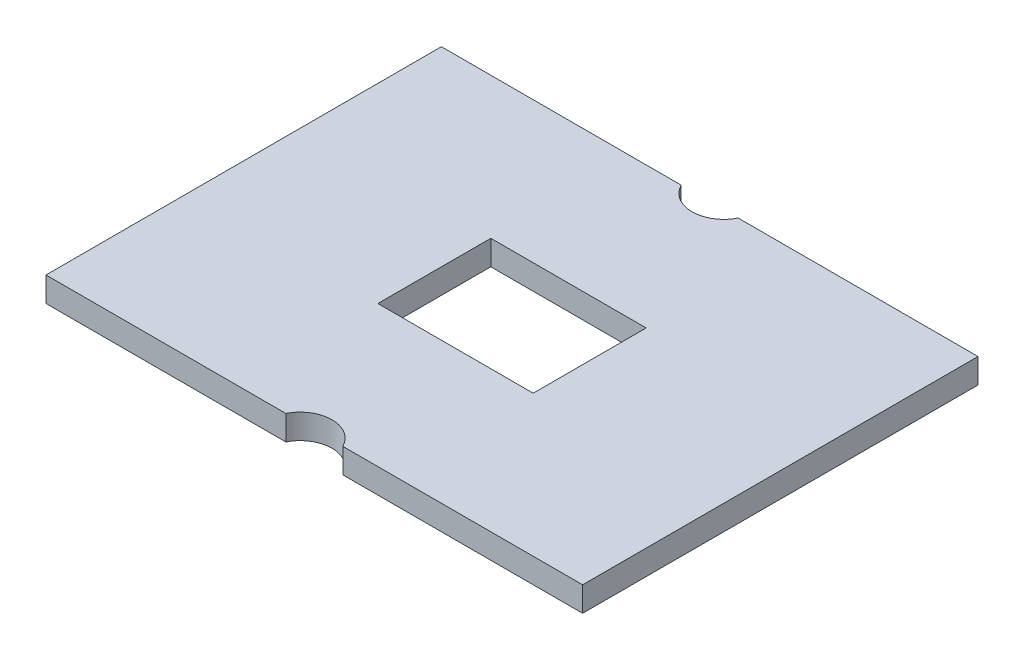
ISO-10303-21;
HEADER;
FILE_DESCRIPTION(('STEP AP214'),'2;1');
FILE_NAME('part.step','',(''),(''),'','','');
FILE_SCHEMA(('AUTOMOTIVE_DESIGN { 1 0 10303 214 1 1 1 1 }'));
ENDSEC;
DATA;
#1=APPLICATION_CONTEXT('core data for automotive mechanical design processes');
#2=APPLICATION_PROTOCOL_DEFINITION('international standard','automotive_design',2000,#1);
#3=PRODUCT_CONTEXT('',#1,'mechanical');
#4=PRODUCT('Part','Part','',(#3));
#5=PRODUCT_RELATED_PRODUCT_CATEGORY('part','',(#4));
#6=PRODUCT_DEFINITION_FORMATION('','',#4);
#7=PRODUCT_DEFINITION_CONTEXT('part definition',#1,'design');
#8=PRODUCT_DEFINITION('design','',#6,#7);
#9=PRODUCT_DEFINITION_SHAPE('','',#8);
#10=(LENGTH_UNIT() NAMED_UNIT(*) SI_UNIT(.MILLI.,.METRE.));
#11=(NAMED_UNIT(*) PLANE_ANGLE_UNIT() SI_UNIT($,.RADIAN.));
#12=(NAMED_UNIT(*) SI_UNIT($,.STERADIAN.) SOLID_ANGLE_UNIT());
#13=UNCERTAINTY_MEASURE_WITH_UNIT(LENGTH_MEASURE(1.E-05),#10,'distance_accuracy_value','');
#14=(GEOMETRIC_REPRESENTATION_CONTEXT(3) GLOBAL_UNCERTAINTY_ASSIGNED_CONTEXT((#13)) GLOBAL_UNIT_ASSIGNED_CONTEXT((#10,
#11,#12)) REPRESENTATION_CONTEXT('',''));
#15=CARTESIAN_POINT('',(0.,0.,0.));
#16=DIRECTION('',(0.,0.,1.));
#17=DIRECTION('',(1.,0.,0.));
#18=AXIS2_PLACEMENT_3D('',#15,#16,#17);
#19=CARTESIAN_POINT('',(-38.,3.5,-28.));
#20=DIRECTION('',(0.,0.,1.));
#21=DIRECTION('',(1.,0.,0.));
#22=AXIS2_PLACEMENT_3D('',#19,#20,#21);
#23=PLANE('',#22);
#24=DIRECTION('',(-1.,0.,0.));
#25=VECTOR('',#24,1.);
#26=CARTESIAN_POINT('',(-38.,3.5,-28.));
#27=LINE('',#26,#25);
#28=CARTESIAN_POINT('',(-4.03112887414928,3.5,-28.));
#29=VERTEX_POINT('',#28);
#30=CARTESIAN_POINT('',(-38.,3.5,-28.));
#31=VERTEX_POINT('',#30);
#32=EDGE_CURVE('E185',#29,#31,#27,.T.);
#33=ORIENTED_EDGE('',*,*,#32,.F.);
#34=DIRECTION('',(0.,-1.,0.));
#35=VECTOR('',#34,1.);
#36=CARTESIAN_POINT('',(-4.03112887414928,3.5,-28.));
#37=LINE('',#36,#35);
#38=CARTESIAN_POINT('',(-4.03112887414928,0.,-28.));
#39=VERTEX_POINT('',#38);
#40=EDGE_CURVE('E172',#29,#39,#37,.T.);
#41=ORIENTED_EDGE('',*,*,#40,.T.);
#42=DIRECTION('',(-1.,0.,0.));
#43=VECTOR('',#42,1.);
#44=CARTESIAN_POINT('',(-38.,0.,-28.));
#45=LINE('',#44,#43);
#46=CARTESIAN_POINT('',(-38.,0.,-28.));
#47=VERTEX_POINT('',#46);
#48=EDGE_CURVE('E197',#39,#47,#45,.T.);
#49=ORIENTED_EDGE('',*,*,#48,.T.);
#50=DIRECTION('',(0.,-1.,0.));
#51=VECTOR('',#50,1.);
#52=CARTESIAN_POINT('',(-38.,3.5,-28.));
#53=LINE('',#52,#51);
#54=EDGE_CURVE('E209',#31,#47,#53,.T.);
#55=ORIENTED_EDGE('',*,*,#54,.F.);
#56=EDGE_LOOP('',(#33,#41,#49,#55));
#57=FACE_BOUND('',#56,.T.);
#58=ADVANCED_FACE('F39',(#57),#23,.F.);
#59=CARTESIAN_POINT('',(-38.,3.5,28.));
#60=DIRECTION('',(0.,0.,-1.));
#61=DIRECTION('',(-1.,0.,0.));
#62=AXIS2_PLACEMENT_3D('',#59,#60,#61);
#63=PLANE('',#62);
#64=DIRECTION('',(1.,0.,0.));
#65=VECTOR('',#64,1.);
#66=CARTESIAN_POINT('',(-38.,3.5,28.));
#67=LINE('',#66,#65);
#68=CARTESIAN_POINT('',(4.03112887414927,3.5,28.));
#69=VERTEX_POINT('',#68);
#70=CARTESIAN_POINT('',(38.,3.5,28.));
#71=VERTEX_POINT('',#70);
#72=EDGE_CURVE('E188',#69,#71,#67,.T.);
#73=ORIENTED_EDGE('',*,*,#72,.F.);
#74=DIRECTION('',(0.,-1.,0.));
#75=VECTOR('',#74,1.);
#76=CARTESIAN_POINT('',(4.03112887414927,3.5,28.));
#77=LINE('',#76,#75);
#78=CARTESIAN_POINT('',(4.03112887414927,0.,28.));
#79=VERTEX_POINT('',#78);
#80=EDGE_CURVE('E166',#69,#79,#77,.T.);
#81=ORIENTED_EDGE('',*,*,#80,.T.);
#82=DIRECTION('',(1.,0.,0.));
#83=VECTOR('',#82,1.);
#84=CARTESIAN_POINT('',(-38.,0.,28.));
#85=LINE('',#84,#83);
#86=CARTESIAN_POINT('',(38.,0.,28.));
#87=VERTEX_POINT('',#86);
#88=EDGE_CURVE('E205',#79,#87,#85,.T.);
#89=ORIENTED_EDGE('',*,*,#88,.T.);
#90=DIRECTION('',(0.,-1.,0.));
#91=VECTOR('',#90,1.);
#92=CARTESIAN_POINT('',(38.,3.5,28.));
#93=LINE('',#92,#91);
#94=EDGE_CURVE('E194',#71,#87,#93,.T.);
#95=ORIENTED_EDGE('',*,*,#94,.F.);
#96=EDGE_LOOP('',(#73,#81,#89,#95));
#97=FACE_BOUND('',#96,.T.);
#98=ADVANCED_FACE('F249',(#97),#63,.F.);
#99=CARTESIAN_POINT('',(38.,3.5,28.));
#100=DIRECTION('',(-1.,0.,0.));
#101=DIRECTION('',(0.,0.,1.));
#102=AXIS2_PLACEMENT_3D('',#99,#100,#101);
#103=PLANE('',#102);
#104=DIRECTION('',(0.,0.,-1.));
#105=VECTOR('',#104,1.);
#106=CARTESIAN_POINT('',(38.,0.,28.));
#107=LINE('',#106,#105);
#108=CARTESIAN_POINT('',(38.,0.,-28.));
#109=VERTEX_POINT('',#108);
#110=EDGE_CURVE('E178',#87,#109,#107,.T.);
#111=ORIENTED_EDGE('',*,*,#110,.T.);
#112=DIRECTION('',(0.,-1.,0.));
#113=VECTOR('',#112,1.);
#114=CARTESIAN_POINT('',(38.,3.5,-28.));
#115=LINE('',#114,#113);
#116=CARTESIAN_POINT('',(38.,3.5,-28.));
#117=VERTEX_POINT('',#116);
#118=EDGE_CURVE('E43',#117,#109,#115,.T.);
#119=ORIENTED_EDGE('',*,*,#118,.F.);
#120=DIRECTION('',(0.,0.,-1.));
#121=VECTOR('',#120,1.);
#122=CARTESIAN_POINT('',(38.,3.5,28.));
#123=LINE('',#122,#121);
#124=EDGE_CURVE('E177',#71,#117,#123,.T.);
#125=ORIENTED_EDGE('',*,*,#124,.F.);
#126=ORIENTED_EDGE('',*,*,#94,.T.);
#127=EDGE_LOOP('',(#111,#119,#125,#126));
#128=FACE_BOUND('',#127,.T.);
#129=ADVANCED_FACE('F41',(#128),#103,.F.);
#130=CARTESIAN_POINT('',(4.03112887414928,0.,-28.));
#131=VERTEX_POINT('',#130);
#132=EDGE_CURVE('E200',#109,#131,#45,.T.);
#133=ORIENTED_EDGE('',*,*,#132,.T.);
#134=DIRECTION('',(0.,-1.,0.));
#135=VECTOR('',#134,1.);
#136=CARTESIAN_POINT('',(4.03112887414928,3.5,-28.));
#137=LINE('',#136,#135);
#138=CARTESIAN_POINT('',(4.03112887414928,3.5,-28.));
#139=VERTEX_POINT('',#138);
#140=EDGE_CURVE('E175',#131,#139,#137,.F.);
#141=ORIENTED_EDGE('',*,*,#140,.T.);
#142=EDGE_CURVE('E182',#117,#139,#27,.T.);
#143=ORIENTED_EDGE('',*,*,#142,.F.);
#144=ORIENTED_EDGE('',*,*,#118,.T.);
#145=EDGE_LOOP('',(#133,#141,#143,#144));
#146=FACE_BOUND('',#145,.T.);
#147=ADVANCED_FACE('F216',(#146),#23,.F.);
#148=CARTESIAN_POINT('',(-38.,3.5,28.));
#149=DIRECTION('',(1.,0.,0.));
#150=DIRECTION('',(0.,0.,-1.));
#151=AXIS2_PLACEMENT_3D('',#148,#149,#150);
#152=PLANE('',#151);
#153=DIRECTION('',(0.,0.,1.));
#154=VECTOR('',#153,1.);
#155=CARTESIAN_POINT('',(-38.,0.,28.));
#156=LINE('',#155,#154);
#157=CARTESIAN_POINT('',(-38.,0.,28.));
#158=VERTEX_POINT('',#157);
#159=EDGE_CURVE('E196',#47,#158,#156,.T.);
#160=ORIENTED_EDGE('',*,*,#159,.T.);
#161=DIRECTION('',(0.,-1.,0.));
#162=VECTOR('',#161,1.);
#163=CARTESIAN_POINT('',(-38.,3.5,28.));
#164=LINE('',#163,#162);
#165=CARTESIAN_POINT('',(-38.,3.5,28.));
#166=VERTEX_POINT('',#165);
#167=EDGE_CURVE('E210',#166,#158,#164,.T.);
#168=ORIENTED_EDGE('',*,*,#167,.F.);
#169=DIRECTION('',(0.,0.,1.));
#170=VECTOR('',#169,1.);
#171=CARTESIAN_POINT('',(-38.,3.5,28.));
#172=LINE('',#171,#170);
#173=EDGE_CURVE('E190',#31,#166,#172,.T.);
#174=ORIENTED_EDGE('',*,*,#173,.F.);
#175=ORIENTED_EDGE('',*,*,#54,.T.);
#176=EDGE_LOOP('',(#160,#168,#174,#175));
#177=FACE_BOUND('',#176,.T.);
#178=ADVANCED_FACE('F251',(#177),#152,.F.);
#179=CARTESIAN_POINT('',(-4.03112887414927,0.,28.));
#180=VERTEX_POINT('',#179);
#181=EDGE_CURVE('E183',#158,#180,#85,.T.);
#182=ORIENTED_EDGE('',*,*,#181,.T.);
#183=DIRECTION('',(0.,-1.,0.));
#184=VECTOR('',#183,1.);
#185=CARTESIAN_POINT('',(-4.03112887414927,3.5,28.));
#186=LINE('',#185,#184);
#187=CARTESIAN_POINT('',(-4.03112887414927,3.5,28.));
#188=VERTEX_POINT('',#187);
#189=EDGE_CURVE('E168',#180,#188,#186,.F.);
#190=ORIENTED_EDGE('',*,*,#189,.T.);
#191=EDGE_CURVE('E189',#166,#188,#67,.T.);
#192=ORIENTED_EDGE('',*,*,#191,.F.);
#193=ORIENTED_EDGE('',*,*,#167,.T.);
#194=EDGE_LOOP('',(#182,#190,#192,#193));
#195=FACE_BOUND('',#194,.T.);
#196=ADVANCED_FACE('F244',(#195),#63,.F.);
#197=CARTESIAN_POINT('',(0.,3.5,0.));
#198=DIRECTION('',(0.,-1.,0.));
#199=DIRECTION('',(0.,0.,-1.));
#200=AXIS2_PLACEMENT_3D('',#197,#198,#199);
#201=PLANE('',#200);
#202=DIRECTION('',(1.,0.,0.));
#203=VECTOR('',#202,1.);
#204=CARTESIAN_POINT('',(-11.,3.5,-8.));
#205=LINE('',#204,#203);
#206=CARTESIAN_POINT('',(-11.,3.5,-8.));
#207=VERTEX_POINT('',#206);
#208=CARTESIAN_POINT('',(11.,3.5,-8.));
#209=VERTEX_POINT('',#208);
#210=EDGE_CURVE('E156',#207,#209,#205,.T.);
#211=ORIENTED_EDGE('',*,*,#210,.T.);
#212=DIRECTION('',(0.,0.,1.));
#213=VECTOR('',#212,1.);
#214=CARTESIAN_POINT('',(11.,3.5,-8.));
#215=LINE('',#214,#213);
#216=CARTESIAN_POINT('',(11.,3.5,8.));
#217=VERTEX_POINT('',#216);
#218=EDGE_CURVE('E132',#209,#217,#215,.T.);
#219=ORIENTED_EDGE('',*,*,#218,.T.);
#220=DIRECTION('',(-1.,0.,0.));
#221=VECTOR('',#220,1.);
#222=CARTESIAN_POINT('',(-11.,3.5,8.));
#223=LINE('',#222,#221);
#224=CARTESIAN_POINT('',(-11.,3.5,8.));
#225=VERTEX_POINT('',#224);
#226=EDGE_CURVE('E165',#217,#225,#223,.T.);
#227=ORIENTED_EDGE('',*,*,#226,.T.);
#228=DIRECTION('',(0.,0.,-1.));
#229=VECTOR('',#228,1.);
#230=CARTESIAN_POINT('',(-11.,3.5,-8.));
#231=LINE('',#230,#229);
#232=EDGE_CURVE('E54',#225,#207,#231,.T.);
#233=ORIENTED_EDGE('',*,*,#232,.T.);
#234=EDGE_LOOP('',(#211,#219,#227,#233));
#235=FACE_BOUND('',#234,.T.);
#236=ORIENTED_EDGE('',*,*,#142,.T.);
#237=CARTESIAN_POINT('',(0.,3.5,-30.));
#238=DIRECTION('',(0.,-1.,0.));
#239=DIRECTION('',(0.,0.,-1.));
#240=AXIS2_PLACEMENT_3D('',#237,#238,#239);
#241=CIRCLE('',#240,4.5);
#242=EDGE_CURVE('E170',#139,#29,#241,.T.);
#243=ORIENTED_EDGE('',*,*,#242,.T.);
#244=ORIENTED_EDGE('',*,*,#32,.T.);
#245=ORIENTED_EDGE('',*,*,#173,.T.);
#246=ORIENTED_EDGE('',*,*,#191,.T.);
#247=CARTESIAN_POINT('',(0.,3.5,30.));
#248=DIRECTION('',(0.,-1.,0.));
#249=DIRECTION('',(0.,0.,-1.));
#250=AXIS2_PLACEMENT_3D('',#247,#248,#249);
#251=CIRCLE('',#250,4.5);
#252=EDGE_CURVE('E63',#188,#69,#251,.T.);
#253=ORIENTED_EDGE('',*,*,#252,.T.);
#254=ORIENTED_EDGE('',*,*,#72,.T.);
#255=ORIENTED_EDGE('',*,*,#124,.T.);
#256=EDGE_LOOP('',(#236,#243,#244,#245,#246,#253,#254,#255));
#257=FACE_BOUND('',#256,.T.);
#258=ADVANCED_FACE('F242',(#235,#257),#201,.F.);
#259=CARTESIAN_POINT('',(0.,0.,0.));
#260=DIRECTION('',(0.,-1.,0.));
#261=DIRECTION('',(0.,0.,-1.));
#262=AXIS2_PLACEMENT_3D('',#259,#260,#261);
#263=PLANE('',#262);
#264=CARTESIAN_POINT('',(0.,0.,-30.));
#265=DIRECTION('',(0.,-1.,0.));
#266=DIRECTION('',(0.,0.,-1.));
#267=AXIS2_PLACEMENT_3D('',#264,#265,#266);
#268=CIRCLE('',#267,4.5);
#269=EDGE_CURVE('E153',#131,#39,#268,.T.);
#270=ORIENTED_EDGE('',*,*,#269,.F.);
#271=ORIENTED_EDGE('',*,*,#132,.F.);
#272=ORIENTED_EDGE('',*,*,#110,.F.);
#273=ORIENTED_EDGE('',*,*,#88,.F.);
#274=CARTESIAN_POINT('',(0.,0.,30.));
#275=DIRECTION('',(0.,-1.,0.));
#276=DIRECTION('',(0.,0.,-1.));
#277=AXIS2_PLACEMENT_3D('',#274,#275,#276);
#278=CIRCLE('',#277,4.5);
#279=EDGE_CURVE('E11',#180,#79,#278,.T.);
#280=ORIENTED_EDGE('',*,*,#279,.F.);
#281=ORIENTED_EDGE('',*,*,#181,.F.);
#282=ORIENTED_EDGE('',*,*,#159,.F.);
#283=ORIENTED_EDGE('',*,*,#48,.F.);
#284=EDGE_LOOP('',(#270,#271,#272,#273,#280,#281,#282,#283));
#285=FACE_BOUND('',#284,.T.);
#286=DIRECTION('',(0.,0.,1.));
#287=VECTOR('',#286,1.);
#288=CARTESIAN_POINT('',(11.,0.,-8.));
#289=LINE('',#288,#287);
#290=CARTESIAN_POINT('',(11.,0.,-8.));
#291=VERTEX_POINT('',#290);
#292=CARTESIAN_POINT('',(11.,0.,8.));
#293=VERTEX_POINT('',#292);
#294=EDGE_CURVE('E131',#291,#293,#289,.T.);
#295=ORIENTED_EDGE('',*,*,#294,.F.);
#296=DIRECTION('',(1.,0.,0.));
#297=VECTOR('',#296,1.);
#298=CARTESIAN_POINT('',(-11.,0.,-8.));
#299=LINE('',#298,#297);
#300=CARTESIAN_POINT('',(-11.,0.,-8.));
#301=VERTEX_POINT('',#300);
#302=EDGE_CURVE('E141',#301,#291,#299,.T.);
#303=ORIENTED_EDGE('',*,*,#302,.F.);
#304=DIRECTION('',(0.,0.,-1.));
#305=VECTOR('',#304,1.);
#306=CARTESIAN_POINT('',(-11.,0.,-8.));
#307=LINE('',#306,#305);
#308=CARTESIAN_POINT('',(-11.,0.,8.));
#309=VERTEX_POINT('',#308);
#310=EDGE_CURVE('E147',#309,#301,#307,.T.);
#311=ORIENTED_EDGE('',*,*,#310,.F.);
#312=DIRECTION('',(-1.,0.,0.));
#313=VECTOR('',#312,1.);
#314=CARTESIAN_POINT('',(-11.,0.,8.));
#315=LINE('',#314,#313);
#316=EDGE_CURVE('E152',#293,#309,#315,.T.);
#317=ORIENTED_EDGE('',*,*,#316,.F.);
#318=EDGE_LOOP('',(#295,#303,#311,#317));
#319=FACE_BOUND('',#318,.T.);
#320=ADVANCED_FACE('F146',(#285,#319),#263,.T.);
#321=CARTESIAN_POINT('',(11.,3.5,-8.));
#322=DIRECTION('',(1.,0.,0.));
#323=DIRECTION('',(0.,0.,-1.));
#324=AXIS2_PLACEMENT_3D('',#321,#322,#323);
#325=PLANE('',#324);
#326=ORIENTED_EDGE('',*,*,#294,.T.);
#327=DIRECTION('',(0.,-1.,0.));
#328=VECTOR('',#327,1.);
#329=CARTESIAN_POINT('',(11.,3.5,8.));
#330=LINE('',#329,#328);
#331=EDGE_CURVE('E158',#217,#293,#330,.T.);
#332=ORIENTED_EDGE('',*,*,#331,.F.);
#333=ORIENTED_EDGE('',*,*,#218,.F.);
#334=DIRECTION('',(0.,-1.,0.));
#335=VECTOR('',#334,1.);
#336=CARTESIAN_POINT('',(11.,3.5,-8.));
#337=LINE('',#336,#335);
#338=EDGE_CURVE('E130',#209,#291,#337,.T.);
#339=ORIENTED_EDGE('',*,*,#338,.T.);
#340=EDGE_LOOP('',(#326,#332,#333,#339));
#341=FACE_BOUND('',#340,.T.);
#342=ADVANCED_FACE('F129',(#341),#325,.F.);
#343=CARTESIAN_POINT('',(-11.,3.5,-8.));
#344=DIRECTION('',(0.,0.,-1.));
#345=DIRECTION('',(-1.,0.,0.));
#346=AXIS2_PLACEMENT_3D('',#343,#344,#345);
#347=PLANE('',#346);
#348=ORIENTED_EDGE('',*,*,#302,.T.);
#349=ORIENTED_EDGE('',*,*,#338,.F.);
#350=ORIENTED_EDGE('',*,*,#210,.F.);
#351=DIRECTION('',(0.,-1.,0.));
#352=VECTOR('',#351,1.);
#353=CARTESIAN_POINT('',(-11.,3.5,-8.));
#354=LINE('',#353,#352);
#355=EDGE_CURVE('E138',#207,#301,#354,.T.);
#356=ORIENTED_EDGE('',*,*,#355,.T.);
#357=EDGE_LOOP('',(#348,#349,#350,#356));
#358=FACE_BOUND('',#357,.T.);
#359=ADVANCED_FACE('F145',(#358),#347,.F.);
#360=CARTESIAN_POINT('',(-11.,3.5,-8.));
#361=DIRECTION('',(-1.,0.,0.));
#362=DIRECTION('',(0.,0.,1.));
#363=AXIS2_PLACEMENT_3D('',#360,#361,#362);
#364=PLANE('',#363);
#365=ORIENTED_EDGE('',*,*,#310,.T.);
#366=ORIENTED_EDGE('',*,*,#355,.F.);
#367=ORIENTED_EDGE('',*,*,#232,.F.);
#368=DIRECTION('',(0.,-1.,0.));
#369=VECTOR('',#368,1.);
#370=CARTESIAN_POINT('',(-11.,3.5,8.));
#371=LINE('',#370,#369);
#372=EDGE_CURVE('E233',#225,#309,#371,.T.);
#373=ORIENTED_EDGE('',*,*,#372,.T.);
#374=EDGE_LOOP('',(#365,#366,#367,#373));
#375=FACE_BOUND('',#374,.T.);
#376=ADVANCED_FACE('F237',(#375),#364,.F.);
#377=CARTESIAN_POINT('',(-11.,3.5,8.));
#378=DIRECTION('',(0.,0.,1.));
#379=DIRECTION('',(1.,0.,0.));
#380=AXIS2_PLACEMENT_3D('',#377,#378,#379);
#381=PLANE('',#380);
#382=ORIENTED_EDGE('',*,*,#316,.T.);
#383=ORIENTED_EDGE('',*,*,#372,.F.);
#384=ORIENTED_EDGE('',*,*,#226,.F.);
#385=ORIENTED_EDGE('',*,*,#331,.T.);
#386=EDGE_LOOP('',(#382,#383,#384,#385));
#387=FACE_BOUND('',#386,.T.);
#388=ADVANCED_FACE('F236',(#387),#381,.F.);
#389=CARTESIAN_POINT('',(0.,3.5,30.));
#390=DIRECTION('',(0.,-1.,0.));
#391=DIRECTION('',(0.,0.,-1.));
#392=AXIS2_PLACEMENT_3D('',#389,#390,#391);
#393=CYLINDRICAL_SURFACE('',#392,4.5);
#394=ORIENTED_EDGE('',*,*,#252,.F.);
#395=ORIENTED_EDGE('',*,*,#189,.F.);
#396=ORIENTED_EDGE('',*,*,#279,.T.);
#397=ORIENTED_EDGE('',*,*,#80,.F.);
#398=EDGE_LOOP('',(#394,#395,#396,#397));
#399=FACE_BOUND('',#398,.T.);
#400=ADVANCED_FACE('F248',(#399),#393,.F.);
#401=CARTESIAN_POINT('',(0.,3.5,-30.));
#402=DIRECTION('',(0.,-1.,0.));
#403=DIRECTION('',(0.,0.,-1.));
#404=AXIS2_PLACEMENT_3D('',#401,#402,#403);
#405=CYLINDRICAL_SURFACE('',#404,4.5);
#406=ORIENTED_EDGE('',*,*,#242,.F.);
#407=ORIENTED_EDGE('',*,*,#140,.F.);
#408=ORIENTED_EDGE('',*,*,#269,.T.);
#409=ORIENTED_EDGE('',*,*,#40,.F.);
#410=EDGE_LOOP('',(#406,#407,#408,#409));
#411=FACE_BOUND('',#410,.T.);
#412=ADVANCED_FACE('F257',(#411),#405,.F.);
#413=CLOSED_SHELL('',(#58,#98,#129,#147,#178,#196,#258,#320,#342,#359,#376,#388,#400,#412));
#414=MANIFOLD_SOLID_BREP('B2',#413);
#415=ADVANCED_BREP_SHAPE_REPRESENTATION('',(#18,#414),#14);
#416=SHAPE_DEFINITION_REPRESENTATION(#9,#415);
ENDSEC;
END-ISO-10303-21;
